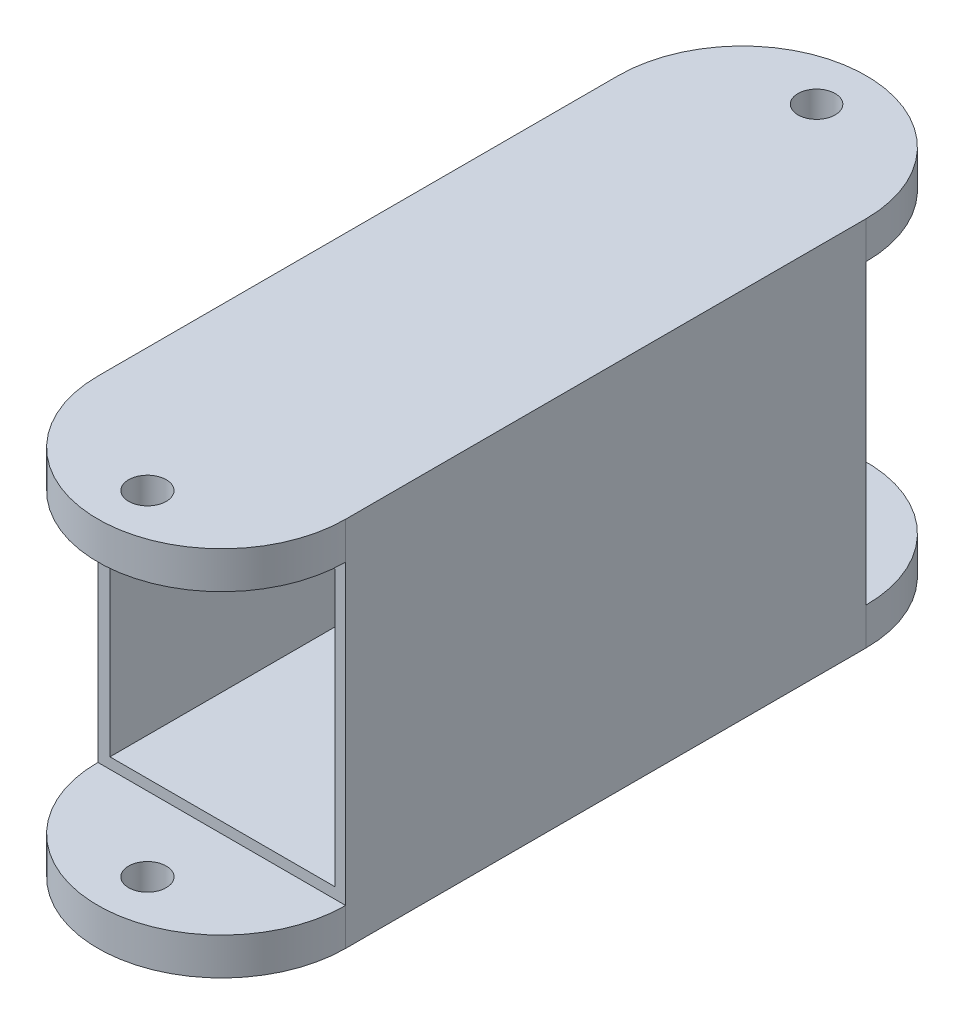
ISO-10303-21;
HEADER;
FILE_DESCRIPTION(('STEP AP214'),'2;1');
FILE_NAME('part.step','',(''),(''),'','','');
FILE_SCHEMA(('AUTOMOTIVE_DESIGN { 1 0 10303 214 1 1 1 1 }'));
ENDSEC;
DATA;
#1=APPLICATION_CONTEXT('core data for automotive mechanical design processes');
#2=APPLICATION_PROTOCOL_DEFINITION('international standard','automotive_design',2000,#1);
#3=PRODUCT_CONTEXT('',#1,'mechanical');
#4=PRODUCT('Part','Part','',(#3));
#5=PRODUCT_RELATED_PRODUCT_CATEGORY('part','',(#4));
#6=PRODUCT_DEFINITION_FORMATION('','',#4);
#7=PRODUCT_DEFINITION_CONTEXT('part definition',#1,'design');
#8=PRODUCT_DEFINITION('design','',#6,#7);
#9=PRODUCT_DEFINITION_SHAPE('','',#8);
#10=(LENGTH_UNIT() NAMED_UNIT(*) SI_UNIT(.MILLI.,.METRE.));
#11=(NAMED_UNIT(*) PLANE_ANGLE_UNIT() SI_UNIT($,.RADIAN.));
#12=(NAMED_UNIT(*) SI_UNIT($,.STERADIAN.) SOLID_ANGLE_UNIT());
#13=UNCERTAINTY_MEASURE_WITH_UNIT(LENGTH_MEASURE(1.E-05),#10,'distance_accuracy_value','');
#14=(GEOMETRIC_REPRESENTATION_CONTEXT(3) GLOBAL_UNCERTAINTY_ASSIGNED_CONTEXT((#13)) GLOBAL_UNIT_ASSIGNED_CONTEXT((#10,
#11,#12)) REPRESENTATION_CONTEXT('',''));
#15=CARTESIAN_POINT('',(0.,0.,0.));
#16=DIRECTION('',(0.,0.,1.));
#17=DIRECTION('',(1.,0.,0.));
#18=AXIS2_PLACEMENT_3D('',#15,#16,#17);
#19=CARTESIAN_POINT('',(0.,-7.5,-10.5));
#20=DIRECTION('',(0.,1.,0.));
#21=DIRECTION('',(0.,0.,1.));
#22=AXIS2_PLACEMENT_3D('',#19,#20,#21);
#23=PLANE('',#22);
#24=DIRECTION('',(0.,0.,-1.));
#25=VECTOR('',#24,1.);
#26=CARTESIAN_POINT('',(10.,-7.5,0.));
#27=LINE('',#26,#25);
#28=CARTESIAN_POINT('',(10.,-7.5,10.5));
#29=VERTEX_POINT('',#28);
#30=CARTESIAN_POINT('',(10.,-7.5,-10.5));
#31=VERTEX_POINT('',#30);
#32=EDGE_CURVE('E151',#29,#31,#27,.T.);
#33=ORIENTED_EDGE('',*,*,#32,.F.);
#34=CARTESIAN_POINT('',(5.,-7.5,10.5));
#35=DIRECTION('',(0.,1.,0.));
#36=DIRECTION('',(0.,0.,-1.));
#37=AXIS2_PLACEMENT_3D('',#34,#35,#36);
#38=CIRCLE('',#37,5.);
#39=CARTESIAN_POINT('',(0.,-7.5,10.5));
#40=VERTEX_POINT('',#39);
#41=EDGE_CURVE('E189',#40,#29,#38,.T.);
#42=ORIENTED_EDGE('',*,*,#41,.F.);
#43=DIRECTION('',(0.,0.,-1.));
#44=VECTOR('',#43,1.);
#45=CARTESIAN_POINT('',(0.,-7.5,0.));
#46=LINE('',#45,#44);
#47=CARTESIAN_POINT('',(0.,-7.5,-10.5));
#48=VERTEX_POINT('',#47);
#49=EDGE_CURVE('E156',#40,#48,#46,.T.);
#50=ORIENTED_EDGE('',*,*,#49,.T.);
#51=CARTESIAN_POINT('',(5.,-7.5,-10.5));
#52=DIRECTION('',(0.,1.,0.));
#53=DIRECTION('',(0.,0.,1.));
#54=AXIS2_PLACEMENT_3D('',#51,#52,#53);
#55=CIRCLE('',#54,5.);
#56=EDGE_CURVE('E221',#31,#48,#55,.T.);
#57=ORIENTED_EDGE('',*,*,#56,.F.);
#58=EDGE_LOOP('',(#33,#42,#50,#57));
#59=FACE_BOUND('',#58,.T.);
#60=CARTESIAN_POINT('',(5.,-7.5,13.5));
#61=DIRECTION('',(0.,1.,0.));
#62=DIRECTION('',(0.,0.,1.));
#63=AXIS2_PLACEMENT_3D('',#60,#61,#62);
#64=CIRCLE('',#63,0.759232067100159);
#65=CARTESIAN_POINT('',(5.,-7.5,14.2592320671002));
#66=VERTEX_POINT('',#65);
#67=EDGE_CURVE('E211',#66,#66,#64,.T.);
#68=ORIENTED_EDGE('',*,*,#67,.T.);
#69=EDGE_LOOP('',(#68));
#70=FACE_BOUND('',#69,.T.);
#71=CARTESIAN_POINT('',(5.,-7.5,-13.5));
#72=DIRECTION('',(0.,1.,0.));
#73=DIRECTION('',(0.,0.,1.));
#74=AXIS2_PLACEMENT_3D('',#71,#72,#73);
#75=CIRCLE('',#74,0.75);
#76=CARTESIAN_POINT('',(5.,-7.5,-12.75));
#77=VERTEX_POINT('',#76);
#78=EDGE_CURVE('E216',#77,#77,#75,.T.);
#79=ORIENTED_EDGE('',*,*,#78,.T.);
#80=EDGE_LOOP('',(#79));
#81=FACE_BOUND('',#80,.T.);
#82=ADVANCED_FACE('F33',(#59,#70,#81),#23,.F.);
#83=CARTESIAN_POINT('',(0.,-6.,-10.5));
#84=DIRECTION('',(0.,0.,-1.));
#85=DIRECTION('',(-1.,0.,0.));
#86=AXIS2_PLACEMENT_3D('',#83,#84,#85);
#87=PLANE('',#86);
#88=DIRECTION('',(0.,-1.,0.));
#89=VECTOR('',#88,1.);
#90=CARTESIAN_POINT('',(9.57542832331803,5.54088567594484,-10.5));
#91=LINE('',#90,#89);
#92=CARTESIAN_POINT('',(9.57542832331803,5.54088567594484,-10.5));
#93=VERTEX_POINT('',#92);
#94=CARTESIAN_POINT('',(9.57542832331803,-5.56187387926266,-10.5));
#95=VERTEX_POINT('',#94);
#96=EDGE_CURVE('E48',#93,#95,#91,.T.);
#97=ORIENTED_EDGE('',*,*,#96,.F.);
#98=DIRECTION('',(1.,0.,0.));
#99=VECTOR('',#98,1.);
#100=CARTESIAN_POINT('',(9.57542832331803,5.54088567594484,-10.5));
#101=LINE('',#100,#99);
#102=CARTESIAN_POINT('',(0.487536286635892,5.54088567594484,-10.5));
#103=VERTEX_POINT('',#102);
#104=EDGE_CURVE('E141',#103,#93,#101,.T.);
#105=ORIENTED_EDGE('',*,*,#104,.F.);
#106=DIRECTION('',(0.,1.,0.));
#107=VECTOR('',#106,1.);
#108=CARTESIAN_POINT('',(0.487536286635892,5.54088567594484,-10.5));
#109=LINE('',#108,#107);
#110=CARTESIAN_POINT('',(0.487536286635892,-5.56187387926266,-10.5));
#111=VERTEX_POINT('',#110);
#112=EDGE_CURVE('E125',#111,#103,#109,.T.);
#113=ORIENTED_EDGE('',*,*,#112,.F.);
#114=DIRECTION('',(-1.,0.,0.));
#115=VECTOR('',#114,1.);
#116=CARTESIAN_POINT('',(9.57542832331803,-5.56187387926266,-10.5));
#117=LINE('',#116,#115);
#118=EDGE_CURVE('E134',#95,#111,#117,.T.);
#119=ORIENTED_EDGE('',*,*,#118,.F.);
#120=EDGE_LOOP('',(#97,#105,#113,#119));
#121=FACE_BOUND('',#120,.T.);
#122=DIRECTION('',(0.,1.,0.));
#123=VECTOR('',#122,1.);
#124=CARTESIAN_POINT('',(10.,0.,-10.5));
#125=LINE('',#124,#123);
#126=CARTESIAN_POINT('',(10.,-6.,-10.5));
#127=VERTEX_POINT('',#126);
#128=CARTESIAN_POINT('',(10.,6.,-10.5));
#129=VERTEX_POINT('',#128);
#130=EDGE_CURVE('E155',#127,#129,#125,.T.);
#131=ORIENTED_EDGE('',*,*,#130,.F.);
#132=DIRECTION('',(1.,0.,0.));
#133=VECTOR('',#132,1.);
#134=CARTESIAN_POINT('',(5.,-6.,-10.5));
#135=LINE('',#134,#133);
#136=CARTESIAN_POINT('',(0.,-6.,-10.5));
#137=VERTEX_POINT('',#136);
#138=EDGE_CURVE('E163',#137,#127,#135,.T.);
#139=ORIENTED_EDGE('',*,*,#138,.F.);
#140=DIRECTION('',(0.,1.,0.));
#141=VECTOR('',#140,1.);
#142=CARTESIAN_POINT('',(0.,0.,-10.5));
#143=LINE('',#142,#141);
#144=CARTESIAN_POINT('',(0.,6.,-10.5));
#145=VERTEX_POINT('',#144);
#146=EDGE_CURVE('E169',#137,#145,#143,.T.);
#147=ORIENTED_EDGE('',*,*,#146,.T.);
#148=DIRECTION('',(1.,0.,0.));
#149=VECTOR('',#148,1.);
#150=CARTESIAN_POINT('',(5.,6.,-10.5));
#151=LINE('',#150,#149);
#152=EDGE_CURVE('E164',#145,#129,#151,.T.);
#153=ORIENTED_EDGE('',*,*,#152,.T.);
#154=EDGE_LOOP('',(#131,#139,#147,#153));
#155=FACE_BOUND('',#154,.T.);
#156=ADVANCED_FACE('F138',(#121,#155),#87,.T.);
#157=CARTESIAN_POINT('',(0.,7.5,-10.5));
#158=DIRECTION('',(0.,-1.,0.));
#159=DIRECTION('',(0.,0.,-1.));
#160=AXIS2_PLACEMENT_3D('',#157,#158,#159);
#161=PLANE('',#160);
#162=DIRECTION('',(0.,0.,1.));
#163=VECTOR('',#162,1.);
#164=CARTESIAN_POINT('',(10.,7.5,0.));
#165=LINE('',#164,#163);
#166=CARTESIAN_POINT('',(10.,7.5,-10.5));
#167=VERTEX_POINT('',#166);
#168=CARTESIAN_POINT('',(10.,7.5,10.5));
#169=VERTEX_POINT('',#168);
#170=EDGE_CURVE('E175',#167,#169,#165,.T.);
#171=ORIENTED_EDGE('',*,*,#170,.F.);
#172=CARTESIAN_POINT('',(5.,7.5,-10.5));
#173=DIRECTION('',(0.,-1.,0.));
#174=DIRECTION('',(0.,0.,1.));
#175=AXIS2_PLACEMENT_3D('',#172,#173,#174);
#176=CIRCLE('',#175,5.);
#177=CARTESIAN_POINT('',(0.,7.5,-10.5));
#178=VERTEX_POINT('',#177);
#179=EDGE_CURVE('E208',#178,#167,#176,.T.);
#180=ORIENTED_EDGE('',*,*,#179,.F.);
#181=DIRECTION('',(0.,0.,1.));
#182=VECTOR('',#181,1.);
#183=CARTESIAN_POINT('',(0.,7.5,0.));
#184=LINE('',#183,#182);
#185=CARTESIAN_POINT('',(0.,7.5,10.5));
#186=VERTEX_POINT('',#185);
#187=EDGE_CURVE('E179',#178,#186,#184,.T.);
#188=ORIENTED_EDGE('',*,*,#187,.T.);
#189=CARTESIAN_POINT('',(5.,7.5,10.5));
#190=DIRECTION('',(0.,-1.,0.));
#191=DIRECTION('',(0.,0.,-1.));
#192=AXIS2_PLACEMENT_3D('',#189,#190,#191);
#193=CIRCLE('',#192,5.);
#194=EDGE_CURVE('E201',#169,#186,#193,.T.);
#195=ORIENTED_EDGE('',*,*,#194,.F.);
#196=EDGE_LOOP('',(#171,#180,#188,#195));
#197=FACE_BOUND('',#196,.T.);
#198=CARTESIAN_POINT('',(5.,7.5,-13.5));
#199=DIRECTION('',(0.,1.,0.));
#200=DIRECTION('',(0.,0.,1.));
#201=AXIS2_PLACEMENT_3D('',#198,#199,#200);
#202=CIRCLE('',#201,0.75);
#203=CARTESIAN_POINT('',(5.,7.5,-12.75));
#204=VERTEX_POINT('',#203);
#205=EDGE_CURVE('E205',#204,#204,#202,.T.);
#206=ORIENTED_EDGE('',*,*,#205,.F.);
#207=EDGE_LOOP('',(#206));
#208=FACE_BOUND('',#207,.T.);
#209=CARTESIAN_POINT('',(5.,7.5,13.5));
#210=DIRECTION('',(0.,1.,0.));
#211=DIRECTION('',(0.,0.,1.));
#212=AXIS2_PLACEMENT_3D('',#209,#210,#211);
#213=CIRCLE('',#212,0.759232067100159);
#214=CARTESIAN_POINT('',(5.,7.5,14.2592320671002));
#215=VERTEX_POINT('',#214);
#216=EDGE_CURVE('E198',#215,#215,#213,.T.);
#217=ORIENTED_EDGE('',*,*,#216,.F.);
#218=EDGE_LOOP('',(#217));
#219=FACE_BOUND('',#218,.T.);
#220=ADVANCED_FACE('F291',(#197,#208,#219),#161,.F.);
#221=CARTESIAN_POINT('',(0.,-6.,10.5));
#222=DIRECTION('',(0.,0.,-1.));
#223=DIRECTION('',(-1.,0.,0.));
#224=AXIS2_PLACEMENT_3D('',#221,#222,#223);
#225=PLANE('',#224);
#226=DIRECTION('',(1.,0.,0.));
#227=VECTOR('',#226,1.);
#228=CARTESIAN_POINT('',(0.,5.54088567594484,10.5));
#229=LINE('',#228,#227);
#230=CARTESIAN_POINT('',(0.487536286635892,5.54088567594484,10.5));
#231=VERTEX_POINT('',#230);
#232=CARTESIAN_POINT('',(9.57542832331803,5.54088567594484,10.5));
#233=VERTEX_POINT('',#232);
#234=EDGE_CURVE('E255',#231,#233,#229,.T.);
#235=ORIENTED_EDGE('',*,*,#234,.T.);
#236=DIRECTION('',(0.,-1.,0.));
#237=VECTOR('',#236,1.);
#238=CARTESIAN_POINT('',(9.57542832331803,-6.,10.5));
#239=LINE('',#238,#237);
#240=CARTESIAN_POINT('',(9.57542832331803,-5.56187387926266,10.5));
#241=VERTEX_POINT('',#240);
#242=EDGE_CURVE('E258',#233,#241,#239,.T.);
#243=ORIENTED_EDGE('',*,*,#242,.T.);
#244=DIRECTION('',(-1.,0.,0.));
#245=VECTOR('',#244,1.);
#246=CARTESIAN_POINT('',(0.,-5.56187387926266,10.5));
#247=LINE('',#246,#245);
#248=CARTESIAN_POINT('',(0.487536286635892,-5.56187387926266,10.5));
#249=VERTEX_POINT('',#248);
#250=EDGE_CURVE('E154',#241,#249,#247,.T.);
#251=ORIENTED_EDGE('',*,*,#250,.T.);
#252=DIRECTION('',(0.,1.,0.));
#253=VECTOR('',#252,1.);
#254=CARTESIAN_POINT('',(0.487536286635892,-6.,10.5));
#255=LINE('',#254,#253);
#256=EDGE_CURVE('E128',#249,#231,#255,.T.);
#257=ORIENTED_EDGE('',*,*,#256,.T.);
#258=EDGE_LOOP('',(#235,#243,#251,#257));
#259=FACE_BOUND('',#258,.T.);
#260=DIRECTION('',(0.,-1.,0.));
#261=VECTOR('',#260,1.);
#262=CARTESIAN_POINT('',(10.,0.,10.5));
#263=LINE('',#262,#261);
#264=CARTESIAN_POINT('',(10.,6.,10.5));
#265=VERTEX_POINT('',#264);
#266=CARTESIAN_POINT('',(10.,-6.,10.5));
#267=VERTEX_POINT('',#266);
#268=EDGE_CURVE('E178',#265,#267,#263,.T.);
#269=ORIENTED_EDGE('',*,*,#268,.F.);
#270=DIRECTION('',(1.,0.,0.));
#271=VECTOR('',#270,1.);
#272=CARTESIAN_POINT('',(5.,6.,10.5));
#273=LINE('',#272,#271);
#274=CARTESIAN_POINT('',(0.,6.,10.5));
#275=VERTEX_POINT('',#274);
#276=EDGE_CURVE('E185',#275,#265,#273,.T.);
#277=ORIENTED_EDGE('',*,*,#276,.F.);
#278=DIRECTION('',(0.,-1.,0.));
#279=VECTOR('',#278,1.);
#280=CARTESIAN_POINT('',(0.,0.,10.5));
#281=LINE('',#280,#279);
#282=CARTESIAN_POINT('',(0.,-6.,10.5));
#283=VERTEX_POINT('',#282);
#284=EDGE_CURVE('E191',#275,#283,#281,.T.);
#285=ORIENTED_EDGE('',*,*,#284,.T.);
#286=DIRECTION('',(1.,0.,0.));
#287=VECTOR('',#286,1.);
#288=CARTESIAN_POINT('',(5.,-6.,10.5));
#289=LINE('',#288,#287);
#290=EDGE_CURVE('E186',#283,#267,#289,.T.);
#291=ORIENTED_EDGE('',*,*,#290,.T.);
#292=EDGE_LOOP('',(#269,#277,#285,#291));
#293=FACE_BOUND('',#292,.T.);
#294=ADVANCED_FACE('F279',(#259,#293),#225,.F.);
#295=CARTESIAN_POINT('',(5.,-2.5,13.5));
#296=DIRECTION('',(0.,1.,0.));
#297=DIRECTION('',(0.,0.,1.));
#298=AXIS2_PLACEMENT_3D('',#295,#296,#297);
#299=CYLINDRICAL_SURFACE('',#298,0.759232067100159);
#300=CARTESIAN_POINT('',(5.,6.,13.5));
#301=DIRECTION('',(0.,1.,0.));
#302=DIRECTION('',(0.,0.,1.));
#303=AXIS2_PLACEMENT_3D('',#300,#301,#302);
#304=CIRCLE('',#303,0.759232067100159);
#305=CARTESIAN_POINT('',(5.,6.,14.2592320671002));
#306=VERTEX_POINT('',#305);
#307=EDGE_CURVE('E197',#306,#306,#304,.T.);
#308=ORIENTED_EDGE('',*,*,#307,.F.);
#309=EDGE_LOOP('',(#308));
#310=FACE_BOUND('',#309,.T.);
#311=ORIENTED_EDGE('',*,*,#216,.T.);
#312=EDGE_LOOP('',(#311));
#313=FACE_BOUND('',#312,.T.);
#314=ADVANCED_FACE('F343',(#310,#313),#299,.F.);
#315=CARTESIAN_POINT('',(5.,-2.5,-13.5));
#316=DIRECTION('',(0.,1.,0.));
#317=DIRECTION('',(0.,0.,1.));
#318=AXIS2_PLACEMENT_3D('',#315,#316,#317);
#319=CYLINDRICAL_SURFACE('',#318,0.75);
#320=CARTESIAN_POINT('',(5.,6.,-13.5));
#321=DIRECTION('',(0.,1.,0.));
#322=DIRECTION('',(0.,0.,1.));
#323=AXIS2_PLACEMENT_3D('',#320,#321,#322);
#324=CIRCLE('',#323,0.75);
#325=CARTESIAN_POINT('',(5.,6.,-12.75));
#326=VERTEX_POINT('',#325);
#327=EDGE_CURVE('E204',#326,#326,#324,.T.);
#328=ORIENTED_EDGE('',*,*,#327,.F.);
#329=EDGE_LOOP('',(#328));
#330=FACE_BOUND('',#329,.T.);
#331=ORIENTED_EDGE('',*,*,#205,.T.);
#332=EDGE_LOOP('',(#331));
#333=FACE_BOUND('',#332,.T.);
#334=ADVANCED_FACE('F323',(#330,#333),#319,.F.);
#335=CARTESIAN_POINT('',(5.,-2.5,13.5));
#336=DIRECTION('',(0.,1.,0.));
#337=DIRECTION('',(0.,0.,1.));
#338=AXIS2_PLACEMENT_3D('',#335,#336,#337);
#339=CYLINDRICAL_SURFACE('',#338,0.759232067100159);
#340=ORIENTED_EDGE('',*,*,#67,.F.);
#341=EDGE_LOOP('',(#340));
#342=FACE_BOUND('',#341,.T.);
#343=CARTESIAN_POINT('',(5.,-6.,13.5));
#344=DIRECTION('',(0.,1.,0.));
#345=DIRECTION('',(0.,0.,1.));
#346=AXIS2_PLACEMENT_3D('',#343,#344,#345);
#347=CIRCLE('',#346,0.759232067100159);
#348=CARTESIAN_POINT('',(5.,-6.,14.2592320671002));
#349=VERTEX_POINT('',#348);
#350=EDGE_CURVE('E194',#349,#349,#347,.T.);
#351=ORIENTED_EDGE('',*,*,#350,.T.);
#352=EDGE_LOOP('',(#351));
#353=FACE_BOUND('',#352,.T.);
#354=ADVANCED_FACE('F315',(#342,#353),#339,.F.);
#355=CARTESIAN_POINT('',(5.,-2.5,-13.5));
#356=DIRECTION('',(0.,1.,0.));
#357=DIRECTION('',(0.,0.,1.));
#358=AXIS2_PLACEMENT_3D('',#355,#356,#357);
#359=CYLINDRICAL_SURFACE('',#358,0.75);
#360=ORIENTED_EDGE('',*,*,#78,.F.);
#361=EDGE_LOOP('',(#360));
#362=FACE_BOUND('',#361,.T.);
#363=CARTESIAN_POINT('',(5.,-6.,-13.5));
#364=DIRECTION('',(0.,1.,0.));
#365=DIRECTION('',(0.,0.,1.));
#366=AXIS2_PLACEMENT_3D('',#363,#364,#365);
#367=CIRCLE('',#366,0.75);
#368=CARTESIAN_POINT('',(5.,-6.,-12.75));
#369=VERTEX_POINT('',#368);
#370=EDGE_CURVE('E217',#369,#369,#367,.T.);
#371=ORIENTED_EDGE('',*,*,#370,.T.);
#372=EDGE_LOOP('',(#371));
#373=FACE_BOUND('',#372,.T.);
#374=ADVANCED_FACE('F313',(#362,#373),#359,.F.);
#375=CARTESIAN_POINT('',(5.,0.,-10.5));
#376=DIRECTION('',(0.,1.,0.));
#377=DIRECTION('',(0.,0.,1.));
#378=AXIS2_PLACEMENT_3D('',#375,#376,#377);
#379=CYLINDRICAL_SURFACE('',#378,5.);
#380=DIRECTION('',(0.,1.,0.));
#381=VECTOR('',#380,1.);
#382=CARTESIAN_POINT('',(0.,0.,-10.5));
#383=LINE('',#382,#381);
#384=EDGE_CURVE('E160',#48,#137,#383,.T.);
#385=ORIENTED_EDGE('',*,*,#384,.T.);
#386=CARTESIAN_POINT('',(5.,-6.,-10.5));
#387=DIRECTION('',(0.,-1.,0.));
#388=DIRECTION('',(0.,0.,1.));
#389=AXIS2_PLACEMENT_3D('',#386,#387,#388);
#390=CIRCLE('',#389,5.);
#391=EDGE_CURVE('E220',#137,#127,#390,.T.);
#392=ORIENTED_EDGE('',*,*,#391,.T.);
#393=DIRECTION('',(0.,1.,0.));
#394=VECTOR('',#393,1.);
#395=CARTESIAN_POINT('',(10.,0.,-10.5));
#396=LINE('',#395,#394);
#397=EDGE_CURVE('E228',#31,#127,#396,.T.);
#398=ORIENTED_EDGE('',*,*,#397,.F.);
#399=ORIENTED_EDGE('',*,*,#56,.T.);
#400=EDGE_LOOP('',(#385,#392,#398,#399));
#401=FACE_BOUND('',#400,.T.);
#402=ADVANCED_FACE('F304',(#401),#379,.T.);
#403=CARTESIAN_POINT('',(0.,-6.,-15.5));
#404=DIRECTION('',(0.,1.,0.));
#405=DIRECTION('',(0.,0.,1.));
#406=AXIS2_PLACEMENT_3D('',#403,#404,#405);
#407=PLANE('',#406);
#408=ORIENTED_EDGE('',*,*,#391,.F.);
#409=ORIENTED_EDGE('',*,*,#138,.T.);
#410=EDGE_LOOP('',(#408,#409));
#411=FACE_BOUND('',#410,.T.);
#412=ORIENTED_EDGE('',*,*,#370,.F.);
#413=EDGE_LOOP('',(#412));
#414=FACE_BOUND('',#413,.T.);
#415=ADVANCED_FACE('F307',(#411,#414),#407,.T.);
#416=CARTESIAN_POINT('',(5.,0.,-10.5));
#417=DIRECTION('',(0.,1.,0.));
#418=DIRECTION('',(0.,0.,1.));
#419=AXIS2_PLACEMENT_3D('',#416,#417,#418);
#420=CYLINDRICAL_SURFACE('',#419,5.);
#421=DIRECTION('',(0.,1.,0.));
#422=VECTOR('',#421,1.);
#423=CARTESIAN_POINT('',(0.,0.,-10.5));
#424=LINE('',#423,#422);
#425=EDGE_CURVE('E172',#145,#178,#424,.T.);
#426=ORIENTED_EDGE('',*,*,#425,.T.);
#427=ORIENTED_EDGE('',*,*,#179,.T.);
#428=DIRECTION('',(0.,1.,0.));
#429=VECTOR('',#428,1.);
#430=CARTESIAN_POINT('',(10.,0.,-10.5));
#431=LINE('',#430,#429);
#432=EDGE_CURVE('E168',#129,#167,#431,.T.);
#433=ORIENTED_EDGE('',*,*,#432,.F.);
#434=CARTESIAN_POINT('',(5.,6.,-10.5));
#435=DIRECTION('',(0.,1.,0.));
#436=DIRECTION('',(0.,0.,1.));
#437=AXIS2_PLACEMENT_3D('',#434,#435,#436);
#438=CIRCLE('',#437,5.);
#439=EDGE_CURVE('E167',#129,#145,#438,.T.);
#440=ORIENTED_EDGE('',*,*,#439,.T.);
#441=EDGE_LOOP('',(#426,#427,#433,#440));
#442=FACE_BOUND('',#441,.T.);
#443=ADVANCED_FACE('F294',(#442),#420,.T.);
#444=CARTESIAN_POINT('',(0.,6.,-15.5));
#445=DIRECTION('',(0.,1.,0.));
#446=DIRECTION('',(0.,0.,1.));
#447=AXIS2_PLACEMENT_3D('',#444,#445,#446);
#448=PLANE('',#447);
#449=ORIENTED_EDGE('',*,*,#439,.F.);
#450=ORIENTED_EDGE('',*,*,#152,.F.);
#451=EDGE_LOOP('',(#449,#450));
#452=FACE_BOUND('',#451,.T.);
#453=ORIENTED_EDGE('',*,*,#327,.T.);
#454=EDGE_LOOP('',(#453));
#455=FACE_BOUND('',#454,.T.);
#456=ADVANCED_FACE('F297',(#452,#455),#448,.F.);
#457=CARTESIAN_POINT('',(5.,0.,10.5));
#458=DIRECTION('',(0.,-1.,0.));
#459=DIRECTION('',(0.,0.,-1.));
#460=AXIS2_PLACEMENT_3D('',#457,#458,#459);
#461=CYLINDRICAL_SURFACE('',#460,5.);
#462=ORIENTED_EDGE('',*,*,#41,.T.);
#463=DIRECTION('',(0.,-1.,0.));
#464=VECTOR('',#463,1.);
#465=CARTESIAN_POINT('',(10.,0.,10.5));
#466=LINE('',#465,#464);
#467=EDGE_CURVE('E239',#267,#29,#466,.T.);
#468=ORIENTED_EDGE('',*,*,#467,.F.);
#469=CARTESIAN_POINT('',(5.,-6.,10.5));
#470=DIRECTION('',(0.,-1.,0.));
#471=DIRECTION('',(0.,0.,-1.));
#472=AXIS2_PLACEMENT_3D('',#469,#470,#471);
#473=CIRCLE('',#472,5.);
#474=EDGE_CURVE('E190',#267,#283,#473,.T.);
#475=ORIENTED_EDGE('',*,*,#474,.T.);
#476=DIRECTION('',(0.,-1.,0.));
#477=VECTOR('',#476,1.);
#478=CARTESIAN_POINT('',(0.,0.,10.5));
#479=LINE('',#478,#477);
#480=EDGE_CURVE('E159',#283,#40,#479,.T.);
#481=ORIENTED_EDGE('',*,*,#480,.T.);
#482=EDGE_LOOP('',(#462,#468,#475,#481));
#483=FACE_BOUND('',#482,.T.);
#484=ADVANCED_FACE('F359',(#483),#461,.T.);
#485=CARTESIAN_POINT('',(0.,-6.,-15.5));
#486=DIRECTION('',(0.,1.,0.));
#487=DIRECTION('',(0.,0.,1.));
#488=AXIS2_PLACEMENT_3D('',#485,#486,#487);
#489=PLANE('',#488);
#490=ORIENTED_EDGE('',*,*,#474,.F.);
#491=ORIENTED_EDGE('',*,*,#290,.F.);
#492=EDGE_LOOP('',(#490,#491));
#493=FACE_BOUND('',#492,.T.);
#494=ORIENTED_EDGE('',*,*,#350,.F.);
#495=EDGE_LOOP('',(#494));
#496=FACE_BOUND('',#495,.T.);
#497=ADVANCED_FACE('F269',(#493,#496),#489,.T.);
#498=CARTESIAN_POINT('',(0.,0.,0.));
#499=DIRECTION('',(1.,0.,0.));
#500=DIRECTION('',(0.,0.,-1.));
#501=AXIS2_PLACEMENT_3D('',#498,#499,#500);
#502=PLANE('',#501);
#503=CARTESIAN_POINT('',(0.,0.,0.));
#504=DIRECTION('',(1.,0.,0.));
#505=DIRECTION('',(0.,0.,-1.));
#506=AXIS2_PLACEMENT_3D('',#503,#504,#505);
#507=CIRCLE('',#506,2.03133897889291);
#508=CARTESIAN_POINT('',(0.,0.,-2.03133897889291));
#509=VERTEX_POINT('',#508);
#510=EDGE_CURVE('E41',#509,#509,#507,.F.);
#511=ORIENTED_EDGE('',*,*,#510,.F.);
#512=EDGE_LOOP('',(#511));
#513=FACE_BOUND('',#512,.T.);
#514=ORIENTED_EDGE('',*,*,#284,.F.);
#515=DIRECTION('',(0.,-1.,0.));
#516=VECTOR('',#515,1.);
#517=CARTESIAN_POINT('',(0.,6.75,10.5));
#518=LINE('',#517,#516);
#519=EDGE_CURVE('E182',#186,#275,#518,.T.);
#520=ORIENTED_EDGE('',*,*,#519,.F.);
#521=ORIENTED_EDGE('',*,*,#187,.F.);
#522=ORIENTED_EDGE('',*,*,#425,.F.);
#523=ORIENTED_EDGE('',*,*,#146,.F.);
#524=ORIENTED_EDGE('',*,*,#384,.F.);
#525=ORIENTED_EDGE('',*,*,#49,.F.);
#526=ORIENTED_EDGE('',*,*,#480,.F.);
#527=EDGE_LOOP('',(#514,#520,#521,#522,#523,#524,#525,#526));
#528=FACE_BOUND('',#527,.T.);
#529=ADVANCED_FACE('F265',(#513,#528),#502,.F.);
#530=CARTESIAN_POINT('',(5.,0.,10.5));
#531=DIRECTION('',(0.,-1.,0.));
#532=DIRECTION('',(0.,0.,-1.));
#533=AXIS2_PLACEMENT_3D('',#530,#531,#532);
#534=CYLINDRICAL_SURFACE('',#533,5.);
#535=ORIENTED_EDGE('',*,*,#519,.T.);
#536=CARTESIAN_POINT('',(5.,6.,10.5));
#537=DIRECTION('',(0.,1.,0.));
#538=DIRECTION('',(0.,0.,-1.));
#539=AXIS2_PLACEMENT_3D('',#536,#537,#538);
#540=CIRCLE('',#539,5.);
#541=EDGE_CURVE('E247',#275,#265,#540,.T.);
#542=ORIENTED_EDGE('',*,*,#541,.T.);
#543=DIRECTION('',(0.,-1.,0.));
#544=VECTOR('',#543,1.);
#545=CARTESIAN_POINT('',(10.,6.75,10.5));
#546=LINE('',#545,#544);
#547=EDGE_CURVE('E148',#169,#265,#546,.T.);
#548=ORIENTED_EDGE('',*,*,#547,.F.);
#549=ORIENTED_EDGE('',*,*,#194,.T.);
#550=EDGE_LOOP('',(#535,#542,#548,#549));
#551=FACE_BOUND('',#550,.T.);
#552=ADVANCED_FACE('F268',(#551),#534,.T.);
#553=CARTESIAN_POINT('',(10.,0.,0.));
#554=DIRECTION('',(1.,0.,0.));
#555=DIRECTION('',(0.,0.,-1.));
#556=AXIS2_PLACEMENT_3D('',#553,#554,#555);
#557=PLANE('',#556);
#558=ORIENTED_EDGE('',*,*,#547,.T.);
#559=ORIENTED_EDGE('',*,*,#268,.T.);
#560=ORIENTED_EDGE('',*,*,#467,.T.);
#561=ORIENTED_EDGE('',*,*,#32,.T.);
#562=ORIENTED_EDGE('',*,*,#397,.T.);
#563=ORIENTED_EDGE('',*,*,#130,.T.);
#564=ORIENTED_EDGE('',*,*,#432,.T.);
#565=ORIENTED_EDGE('',*,*,#170,.T.);
#566=EDGE_LOOP('',(#558,#559,#560,#561,#562,#563,#564,#565));
#567=FACE_BOUND('',#566,.T.);
#568=ADVANCED_FACE('F285',(#567),#557,.T.);
#569=CARTESIAN_POINT('',(0.,6.,-15.5));
#570=DIRECTION('',(0.,1.,0.));
#571=DIRECTION('',(0.,0.,1.));
#572=AXIS2_PLACEMENT_3D('',#569,#570,#571);
#573=PLANE('',#572);
#574=ORIENTED_EDGE('',*,*,#276,.T.);
#575=ORIENTED_EDGE('',*,*,#541,.F.);
#576=EDGE_LOOP('',(#574,#575));
#577=FACE_BOUND('',#576,.T.);
#578=ORIENTED_EDGE('',*,*,#307,.T.);
#579=EDGE_LOOP('',(#578));
#580=FACE_BOUND('',#579,.T.);
#581=ADVANCED_FACE('F35',(#577,#580),#573,.F.);
#582=CARTESIAN_POINT('',(9.57542832331803,5.54088567594484,12.5));
#583=DIRECTION('',(1.,0.,0.));
#584=DIRECTION('',(0.,0.,-1.));
#585=AXIS2_PLACEMENT_3D('',#582,#583,#584);
#586=PLANE('',#585);
#587=CARTESIAN_POINT('',(9.57542832331803,0.,0.));
#588=DIRECTION('',(1.,0.,0.));
#589=DIRECTION('',(0.,0.,-1.));
#590=AXIS2_PLACEMENT_3D('',#587,#588,#589);
#591=CIRCLE('',#590,2.03906443691917);
#592=CARTESIAN_POINT('',(9.57542832331803,0.,-2.03906443691917));
#593=VERTEX_POINT('',#592);
#594=EDGE_CURVE('E11',#593,#593,#591,.F.);
#595=ORIENTED_EDGE('',*,*,#594,.F.);
#596=EDGE_LOOP('',(#595));
#597=FACE_BOUND('',#596,.T.);
#598=DIRECTION('',(0.,0.,-1.));
#599=VECTOR('',#598,1.);
#600=CARTESIAN_POINT('',(9.57542832331803,5.54088567594484,12.5));
#601=LINE('',#600,#599);
#602=EDGE_CURVE('E146',#233,#93,#601,.T.);
#603=ORIENTED_EDGE('',*,*,#602,.T.);
#604=ORIENTED_EDGE('',*,*,#96,.T.);
#605=DIRECTION('',(0.,0.,-1.));
#606=VECTOR('',#605,1.);
#607=CARTESIAN_POINT('',(9.57542832331803,-5.56187387926266,12.5));
#608=LINE('',#607,#606);
#609=EDGE_CURVE('E131',#241,#95,#608,.T.);
#610=ORIENTED_EDGE('',*,*,#609,.F.);
#611=ORIENTED_EDGE('',*,*,#242,.F.);
#612=EDGE_LOOP('',(#603,#604,#610,#611));
#613=FACE_BOUND('',#612,.T.);
#614=ADVANCED_FACE('F336',(#597,#613),#586,.F.);
#615=CARTESIAN_POINT('',(9.57542832331803,5.54088567594484,12.5));
#616=DIRECTION('',(0.,1.,0.));
#617=DIRECTION('',(0.,0.,1.));
#618=AXIS2_PLACEMENT_3D('',#615,#616,#617);
#619=PLANE('',#618);
#620=DIRECTION('',(0.,0.,-1.));
#621=VECTOR('',#620,1.);
#622=CARTESIAN_POINT('',(0.487536286635892,5.54088567594484,12.5));
#623=LINE('',#622,#621);
#624=EDGE_CURVE('E130',#231,#103,#623,.T.);
#625=ORIENTED_EDGE('',*,*,#624,.T.);
#626=ORIENTED_EDGE('',*,*,#104,.T.);
#627=ORIENTED_EDGE('',*,*,#602,.F.);
#628=ORIENTED_EDGE('',*,*,#234,.F.);
#629=EDGE_LOOP('',(#625,#626,#627,#628));
#630=FACE_BOUND('',#629,.T.);
#631=ADVANCED_FACE('F380',(#630),#619,.F.);
#632=CARTESIAN_POINT('',(0.487536286635892,5.54088567594484,12.5));
#633=DIRECTION('',(-1.,0.,0.));
#634=DIRECTION('',(0.,0.,1.));
#635=AXIS2_PLACEMENT_3D('',#632,#633,#634);
#636=PLANE('',#635);
#637=DIRECTION('',(0.,0.,-1.));
#638=VECTOR('',#637,1.);
#639=CARTESIAN_POINT('',(0.487536286635892,-5.56187387926266,12.5));
#640=LINE('',#639,#638);
#641=EDGE_CURVE('E56',#249,#111,#640,.T.);
#642=ORIENTED_EDGE('',*,*,#641,.T.);
#643=ORIENTED_EDGE('',*,*,#112,.T.);
#644=ORIENTED_EDGE('',*,*,#624,.F.);
#645=ORIENTED_EDGE('',*,*,#256,.F.);
#646=EDGE_LOOP('',(#642,#643,#644,#645));
#647=FACE_BOUND('',#646,.T.);
#648=ADVANCED_FACE('F122',(#647),#636,.F.);
#649=CARTESIAN_POINT('',(9.57542832331803,-5.56187387926266,12.5));
#650=DIRECTION('',(0.,-1.,0.));
#651=DIRECTION('',(0.,0.,-1.));
#652=AXIS2_PLACEMENT_3D('',#649,#650,#651);
#653=PLANE('',#652);
#654=ORIENTED_EDGE('',*,*,#609,.T.);
#655=ORIENTED_EDGE('',*,*,#118,.T.);
#656=ORIENTED_EDGE('',*,*,#641,.F.);
#657=ORIENTED_EDGE('',*,*,#250,.F.);
#658=EDGE_LOOP('',(#654,#655,#656,#657));
#659=FACE_BOUND('',#658,.T.);
#660=ADVANCED_FACE('F135',(#659),#653,.F.);
#661=CARTESIAN_POINT('',(-3.,0.,0.));
#662=DIRECTION('',(1.,0.,0.));
#663=DIRECTION('',(0.,0.,-1.));
#664=AXIS2_PLACEMENT_3D('',#661,#662,#663);
#665=CYLINDRICAL_SURFACE('',#664,2.03133897889291);
#666=CARTESIAN_POINT('',(-3.,0.,0.));
#667=DIRECTION('',(-1.,0.,0.));
#668=DIRECTION('',(0.,0.,1.));
#669=AXIS2_PLACEMENT_3D('',#666,#667,#668);
#670=CIRCLE('',#669,2.03133897889291);
#671=CARTESIAN_POINT('',(-3.,0.,2.03133897889291));
#672=VERTEX_POINT('',#671);
#673=EDGE_CURVE('E389',#672,#672,#670,.T.);
#674=ORIENTED_EDGE('',*,*,#673,.F.);
#675=EDGE_LOOP('',(#674));
#676=FACE_BOUND('',#675,.T.);
#677=ORIENTED_EDGE('',*,*,#510,.T.);
#678=EDGE_LOOP('',(#677));
#679=FACE_BOUND('',#678,.T.);
#680=ADVANCED_FACE('F263',(#676,#679),#665,.T.);
#681=CARTESIAN_POINT('',(-3.,0.,0.));
#682=DIRECTION('',(-1.,0.,0.));
#683=DIRECTION('',(0.,0.,1.));
#684=AXIS2_PLACEMENT_3D('',#681,#682,#683);
#685=PLANE('',#684);
#686=ORIENTED_EDGE('',*,*,#673,.T.);
#687=EDGE_LOOP('',(#686));
#688=FACE_BOUND('',#687,.T.);
#689=ADVANCED_FACE('F402',(#688),#685,.T.);
#690=CARTESIAN_POINT('',(6.57542832331803,0.,0.));
#691=DIRECTION('',(1.,0.,0.));
#692=DIRECTION('',(0.,0.,-1.));
#693=AXIS2_PLACEMENT_3D('',#690,#691,#692);
#694=CYLINDRICAL_SURFACE('',#693,2.03906443691917);
#695=CARTESIAN_POINT('',(6.57542832331803,0.,0.));
#696=DIRECTION('',(-1.,0.,0.));
#697=DIRECTION('',(0.,0.,1.));
#698=AXIS2_PLACEMENT_3D('',#695,#696,#697);
#699=CIRCLE('',#698,2.03906443691917);
#700=CARTESIAN_POINT('',(6.57542832331803,0.,2.03906443691917));
#701=VERTEX_POINT('',#700);
#702=EDGE_CURVE('E391',#701,#701,#699,.T.);
#703=ORIENTED_EDGE('',*,*,#702,.F.);
#704=EDGE_LOOP('',(#703));
#705=FACE_BOUND('',#704,.T.);
#706=ORIENTED_EDGE('',*,*,#594,.T.);
#707=EDGE_LOOP('',(#706));
#708=FACE_BOUND('',#707,.T.);
#709=ADVANCED_FACE('F399',(#705,#708),#694,.T.);
#710=CARTESIAN_POINT('',(6.57542832331803,0.,0.));
#711=DIRECTION('',(-1.,0.,0.));
#712=DIRECTION('',(0.,0.,1.));
#713=AXIS2_PLACEMENT_3D('',#710,#711,#712);
#714=PLANE('',#713);
#715=ORIENTED_EDGE('',*,*,#702,.T.);
#716=EDGE_LOOP('',(#715));
#717=FACE_BOUND('',#716,.T.);
#718=ADVANCED_FACE('F397',(#717),#714,.T.);
#719=CLOSED_SHELL('',(#82,#156,#220,#294,#314,#334,#354,#374,#402,#415,#443,#456,#484,#497,#529,
#552,#568,#581,#614,#631,#648,#660,#680,#689,#709,#718));
#720=MANIFOLD_SOLID_BREP('B2',#719);
#721=ADVANCED_BREP_SHAPE_REPRESENTATION('',(#18,#720),#14);
#722=SHAPE_DEFINITION_REPRESENTATION(#9,#721);
ENDSEC;
END-ISO-10303-21;
